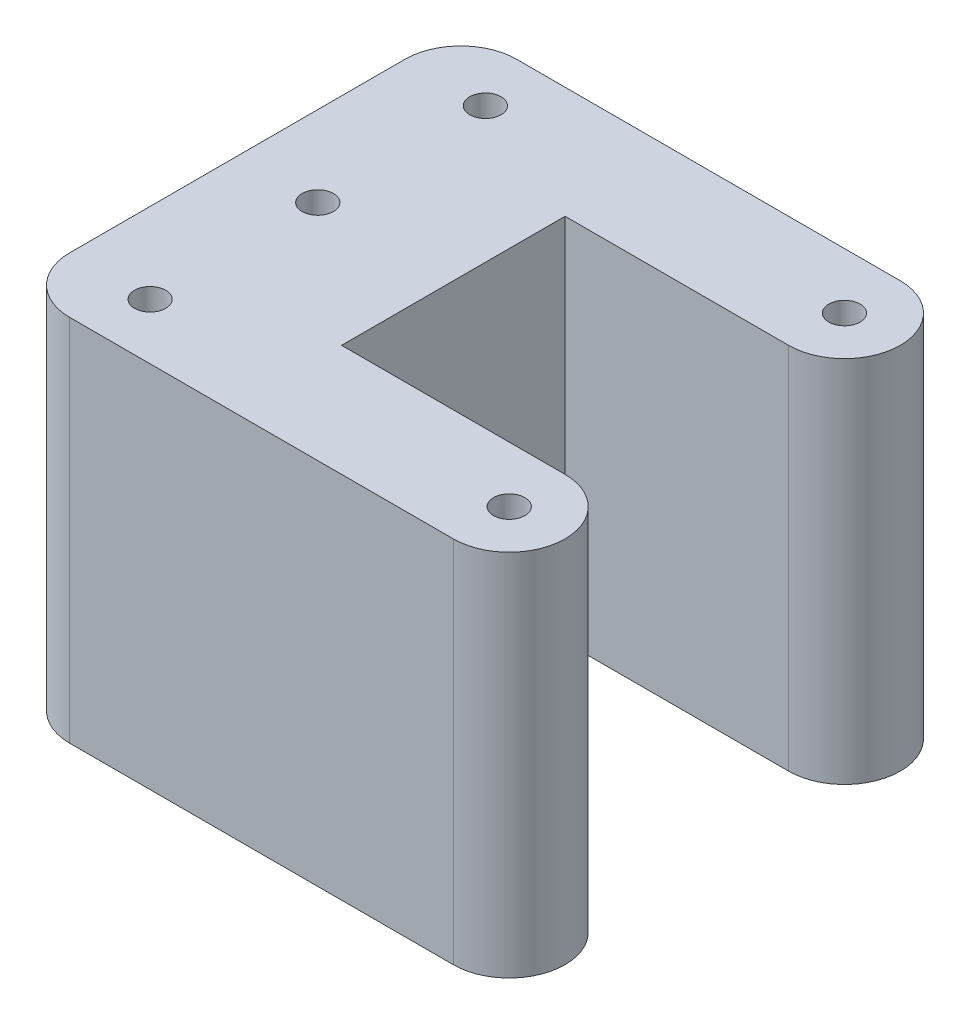
ISO-10303-21;
HEADER;
FILE_DESCRIPTION(('STEP AP214'),'2;1');
FILE_NAME('part.step','',(''),(''),'','','');
FILE_SCHEMA(('AUTOMOTIVE_DESIGN { 1 0 10303 214 1 1 1 1 }'));
ENDSEC;
DATA;
#1=APPLICATION_CONTEXT('core data for automotive mechanical design processes');
#2=APPLICATION_PROTOCOL_DEFINITION('international standard','automotive_design',2000,#1);
#3=PRODUCT_CONTEXT('',#1,'mechanical');
#4=PRODUCT('Part','Part','',(#3));
#5=PRODUCT_RELATED_PRODUCT_CATEGORY('part','',(#4));
#6=PRODUCT_DEFINITION_FORMATION('','',#4);
#7=PRODUCT_DEFINITION_CONTEXT('part definition',#1,'design');
#8=PRODUCT_DEFINITION('design','',#6,#7);
#9=PRODUCT_DEFINITION_SHAPE('','',#8);
#10=(LENGTH_UNIT() NAMED_UNIT(*) SI_UNIT(.MILLI.,.METRE.));
#11=(NAMED_UNIT(*) PLANE_ANGLE_UNIT() SI_UNIT($,.RADIAN.));
#12=(NAMED_UNIT(*) SI_UNIT($,.STERADIAN.) SOLID_ANGLE_UNIT());
#13=UNCERTAINTY_MEASURE_WITH_UNIT(LENGTH_MEASURE(1.E-05),#10,'distance_accuracy_value','');
#14=(GEOMETRIC_REPRESENTATION_CONTEXT(3) GLOBAL_UNCERTAINTY_ASSIGNED_CONTEXT((#13)) GLOBAL_UNIT_ASSIGNED_CONTEXT((#10,
#11,#12)) REPRESENTATION_CONTEXT('',''));
#15=CARTESIAN_POINT('',(0.,0.,0.));
#16=DIRECTION('',(0.,0.,1.));
#17=DIRECTION('',(1.,0.,0.));
#18=AXIS2_PLACEMENT_3D('',#15,#16,#17);
#19=CARTESIAN_POINT('',(83.5391982911814,33.,20.5415917264897));
#20=DIRECTION('',(0.,-1.,0.));
#21=DIRECTION('',(0.,0.,-1.));
#22=AXIS2_PLACEMENT_3D('',#19,#20,#21);
#23=PLANE('',#22);
#24=CARTESIAN_POINT('',(83.5391982911814,33.,20.5415917264897));
#25=DIRECTION('',(0.,1.,0.));
#26=DIRECTION('',(0.,0.,-1.));
#27=AXIS2_PLACEMENT_3D('',#24,#25,#26);
#28=CIRCLE('',#27,4.99999999999941);
#29=CARTESIAN_POINT('',(83.5391982911814,33.,25.541591726489));
#30=VERTEX_POINT('',#29);
#31=CARTESIAN_POINT('',(83.5391982911814,33.,15.5415917264902));
#32=VERTEX_POINT('',#31);
#33=EDGE_CURVE('E163',#30,#32,#28,.T.);
#34=ORIENTED_EDGE('',*,*,#33,.T.);
#35=DIRECTION('',(-1.,0.,0.));
#36=VECTOR('',#35,1.);
#37=CARTESIAN_POINT('',(49.2055026651107,33.,15.5415917264894));
#38=LINE('',#37,#36);
#39=CARTESIAN_POINT('',(49.2055026651107,33.,15.5415917264894));
#40=VERTEX_POINT('',#39);
#41=EDGE_CURVE('E101',#32,#40,#38,.T.);
#42=ORIENTED_EDGE('',*,*,#41,.T.);
#43=CARTESIAN_POINT('',(49.2055026651106,33.,20.5415917264894));
#44=DIRECTION('',(0.,1.,0.));
#45=DIRECTION('',(0.,0.,1.));
#46=AXIS2_PLACEMENT_3D('',#43,#44,#45);
#47=CIRCLE('',#46,5.);
#48=CARTESIAN_POINT('',(44.2055026651106,33.,20.5415917264895));
#49=VERTEX_POINT('',#48);
#50=EDGE_CURVE('E184',#40,#49,#47,.T.);
#51=ORIENTED_EDGE('',*,*,#50,.T.);
#52=DIRECTION('',(0.,0.,1.));
#53=VECTOR('',#52,1.);
#54=CARTESIAN_POINT('',(44.2055026651106,33.,20.5415917264895));
#55=LINE('',#54,#53);
#56=CARTESIAN_POINT('',(44.2055026651109,33.,50.5415917264893));
#57=VERTEX_POINT('',#56);
#58=EDGE_CURVE('E203',#49,#57,#55,.T.);
#59=ORIENTED_EDGE('',*,*,#58,.T.);
#60=CARTESIAN_POINT('',(49.2055026651109,33.,50.5415917264893));
#61=DIRECTION('',(0.,1.,0.));
#62=DIRECTION('',(0.,0.,-1.));
#63=AXIS2_PLACEMENT_3D('',#60,#61,#62);
#64=CIRCLE('',#63,5.);
#65=CARTESIAN_POINT('',(49.2055026651109,33.,55.5415917264893));
#66=VERTEX_POINT('',#65);
#67=EDGE_CURVE('E200',#57,#66,#64,.T.);
#68=ORIENTED_EDGE('',*,*,#67,.T.);
#69=DIRECTION('',(1.,0.,0.));
#70=VECTOR('',#69,1.);
#71=CARTESIAN_POINT('',(49.2055026651109,33.,55.5415917264893));
#72=LINE('',#71,#70);
#73=CARTESIAN_POINT('',(83.5391982911814,33.,55.5415917264893));
#74=VERTEX_POINT('',#73);
#75=EDGE_CURVE('E202',#66,#74,#72,.T.);
#76=ORIENTED_EDGE('',*,*,#75,.T.);
#77=CARTESIAN_POINT('',(83.539198291182,33.,50.5415917264899));
#78=DIRECTION('',(0.,1.,0.));
#79=DIRECTION('',(0.,0.,1.));
#80=AXIS2_PLACEMENT_3D('',#77,#78,#79);
#81=CIRCLE('',#80,4.99999999999941);
#82=CARTESIAN_POINT('',(83.5391982911826,33.,45.5415917264905));
#83=VERTEX_POINT('',#82);
#84=EDGE_CURVE('E126',#74,#83,#81,.T.);
#85=ORIENTED_EDGE('',*,*,#84,.T.);
#86=DIRECTION('',(-1.,0.,0.));
#87=VECTOR('',#86,1.);
#88=CARTESIAN_POINT('',(63.5391982911814,33.,45.5415917264904));
#89=LINE('',#88,#87);
#90=CARTESIAN_POINT('',(63.5391982911814,33.,45.5415917264904));
#91=VERTEX_POINT('',#90);
#92=EDGE_CURVE('E120',#83,#91,#89,.T.);
#93=ORIENTED_EDGE('',*,*,#92,.T.);
#94=DIRECTION('',(0.,0.,-1.));
#95=VECTOR('',#94,1.);
#96=CARTESIAN_POINT('',(63.5391982911814,33.,45.5415917264904));
#97=LINE('',#96,#95);
#98=CARTESIAN_POINT('',(63.5391982911814,33.,25.5415917264891));
#99=VERTEX_POINT('',#98);
#100=EDGE_CURVE('E124',#91,#99,#97,.T.);
#101=ORIENTED_EDGE('',*,*,#100,.T.);
#102=DIRECTION('',(1.,0.,0.));
#103=VECTOR('',#102,1.);
#104=CARTESIAN_POINT('',(63.5391982911814,33.,25.5415917264891));
#105=LINE('',#104,#103);
#106=EDGE_CURVE('E52',#99,#30,#105,.T.);
#107=ORIENTED_EDGE('',*,*,#106,.T.);
#108=EDGE_LOOP('',(#34,#42,#51,#59,#68,#76,#85,#93,#101,#107));
#109=FACE_BOUND('',#108,.T.);
#110=CARTESIAN_POINT('',(83.5391982911814,33.,20.5415917264897));
#111=DIRECTION('',(0.,1.,0.));
#112=DIRECTION('',(0.,0.,1.));
#113=AXIS2_PLACEMENT_3D('',#110,#111,#112);
#114=CIRCLE('',#113,1.39999999999959);
#115=CARTESIAN_POINT('',(83.5391982911814,33.,21.9415917264893));
#116=VERTEX_POINT('',#115);
#117=EDGE_CURVE('E148',#116,#116,#114,.T.);
#118=ORIENTED_EDGE('',*,*,#117,.F.);
#119=EDGE_LOOP('',(#118));
#120=FACE_BOUND('',#119,.T.);
#121=CARTESIAN_POINT('',(83.539198291182,33.,50.5415917264899));
#122=DIRECTION('',(0.,1.,0.));
#123=DIRECTION('',(0.,0.,-1.));
#124=AXIS2_PLACEMENT_3D('',#121,#122,#123);
#125=CIRCLE('',#124,1.4);
#126=CARTESIAN_POINT('',(83.539198291182,33.,49.1415917264899));
#127=VERTEX_POINT('',#126);
#128=EDGE_CURVE('E214',#127,#127,#125,.T.);
#129=ORIENTED_EDGE('',*,*,#128,.F.);
#130=EDGE_LOOP('',(#129));
#131=FACE_BOUND('',#130,.T.);
#132=CARTESIAN_POINT('',(51.4060784315664,33.,20.5415917264911));
#133=DIRECTION('',(0.,1.,0.));
#134=DIRECTION('',(0.,0.,1.));
#135=AXIS2_PLACEMENT_3D('',#132,#133,#134);
#136=CIRCLE('',#135,1.4);
#137=CARTESIAN_POINT('',(51.4060784315664,33.,21.9415917264911));
#138=VERTEX_POINT('',#137);
#139=EDGE_CURVE('E220',#138,#138,#136,.T.);
#140=ORIENTED_EDGE('',*,*,#139,.F.);
#141=EDGE_LOOP('',(#140));
#142=FACE_BOUND('',#141,.T.);
#143=CARTESIAN_POINT('',(51.4060784315664,33.,35.5415917264893));
#144=DIRECTION('',(0.,1.,0.));
#145=DIRECTION('',(0.,0.,1.));
#146=AXIS2_PLACEMENT_3D('',#143,#144,#145);
#147=CIRCLE('',#146,1.4);
#148=CARTESIAN_POINT('',(51.4060784315664,33.,36.9415917264893));
#149=VERTEX_POINT('',#148);
#150=EDGE_CURVE('E226',#149,#149,#147,.T.);
#151=ORIENTED_EDGE('',*,*,#150,.F.);
#152=EDGE_LOOP('',(#151));
#153=FACE_BOUND('',#152,.T.);
#154=CARTESIAN_POINT('',(51.4060784315664,33.,50.5415917264874));
#155=DIRECTION('',(0.,1.,0.));
#156=DIRECTION('',(0.,0.,-1.));
#157=AXIS2_PLACEMENT_3D('',#154,#155,#156);
#158=CIRCLE('',#157,1.39999999999999);
#159=CARTESIAN_POINT('',(51.4060784315664,33.,49.1415917264874));
#160=VERTEX_POINT('',#159);
#161=EDGE_CURVE('E232',#160,#160,#158,.T.);
#162=ORIENTED_EDGE('',*,*,#161,.F.);
#163=EDGE_LOOP('',(#162));
#164=FACE_BOUND('',#163,.T.);
#165=ADVANCED_FACE('F35',(#109,#120,#131,#142,#153,#164),#23,.F.);
#166=CARTESIAN_POINT('',(83.5391982911814,0.,20.5415917264897));
#167=DIRECTION('',(0.,-1.,0.));
#168=DIRECTION('',(0.,0.,-1.));
#169=AXIS2_PLACEMENT_3D('',#166,#167,#168);
#170=PLANE('',#169);
#171=CARTESIAN_POINT('',(51.4060784315664,0.,35.5415917264893));
#172=DIRECTION('',(0.,1.,0.));
#173=DIRECTION('',(0.,0.,1.));
#174=AXIS2_PLACEMENT_3D('',#171,#172,#173);
#175=CIRCLE('',#174,1.4);
#176=CARTESIAN_POINT('',(51.4060784315664,0.,36.9415917264893));
#177=VERTEX_POINT('',#176);
#178=EDGE_CURVE('E229',#177,#177,#175,.T.);
#179=ORIENTED_EDGE('',*,*,#178,.T.);
#180=EDGE_LOOP('',(#179));
#181=FACE_BOUND('',#180,.T.);
#182=CARTESIAN_POINT('',(83.539198291182,0.,50.5415917264899));
#183=DIRECTION('',(0.,1.,0.));
#184=DIRECTION('',(0.,0.,-1.));
#185=AXIS2_PLACEMENT_3D('',#182,#183,#184);
#186=CIRCLE('',#185,1.4);
#187=CARTESIAN_POINT('',(83.539198291182,0.,49.1415917264899));
#188=VERTEX_POINT('',#187);
#189=EDGE_CURVE('E217',#188,#188,#186,.T.);
#190=ORIENTED_EDGE('',*,*,#189,.T.);
#191=EDGE_LOOP('',(#190));
#192=FACE_BOUND('',#191,.T.);
#193=CARTESIAN_POINT('',(83.5391982911814,0.,20.5415917264897));
#194=DIRECTION('',(0.,1.,0.));
#195=DIRECTION('',(0.,0.,-1.));
#196=AXIS2_PLACEMENT_3D('',#193,#194,#195);
#197=CIRCLE('',#196,4.99999999999941);
#198=CARTESIAN_POINT('',(83.5391982911814,0.,25.541591726489));
#199=VERTEX_POINT('',#198);
#200=CARTESIAN_POINT('',(83.5391982911814,0.,15.5415917264902));
#201=VERTEX_POINT('',#200);
#202=EDGE_CURVE('E144',#199,#201,#197,.T.);
#203=ORIENTED_EDGE('',*,*,#202,.F.);
#204=DIRECTION('',(1.,0.,0.));
#205=VECTOR('',#204,1.);
#206=CARTESIAN_POINT('',(63.5391982911814,0.,25.5415917264891));
#207=LINE('',#206,#205);
#208=CARTESIAN_POINT('',(63.5391982911814,0.,25.5415917264891));
#209=VERTEX_POINT('',#208);
#210=EDGE_CURVE('E93',#209,#199,#207,.T.);
#211=ORIENTED_EDGE('',*,*,#210,.F.);
#212=DIRECTION('',(0.,0.,-1.));
#213=VECTOR('',#212,1.);
#214=CARTESIAN_POINT('',(63.5391982911814,0.,45.5415917264904));
#215=LINE('',#214,#213);
#216=CARTESIAN_POINT('',(63.5391982911814,0.,45.5415917264904));
#217=VERTEX_POINT('',#216);
#218=EDGE_CURVE('E87',#217,#209,#215,.T.);
#219=ORIENTED_EDGE('',*,*,#218,.F.);
#220=DIRECTION('',(-1.,0.,0.));
#221=VECTOR('',#220,1.);
#222=CARTESIAN_POINT('',(63.5391982911814,0.,45.5415917264904));
#223=LINE('',#222,#221);
#224=CARTESIAN_POINT('',(83.5391982911826,0.,45.5415917264905));
#225=VERTEX_POINT('',#224);
#226=EDGE_CURVE('E134',#225,#217,#223,.T.);
#227=ORIENTED_EDGE('',*,*,#226,.F.);
#228=CARTESIAN_POINT('',(83.539198291182,0.,50.5415917264899));
#229=DIRECTION('',(0.,1.,0.));
#230=DIRECTION('',(0.,0.,1.));
#231=AXIS2_PLACEMENT_3D('',#228,#229,#230);
#232=CIRCLE('',#231,4.99999999999941);
#233=CARTESIAN_POINT('',(83.5391982911814,0.,55.5415917264893));
#234=VERTEX_POINT('',#233);
#235=EDGE_CURVE('E158',#234,#225,#232,.T.);
#236=ORIENTED_EDGE('',*,*,#235,.F.);
#237=DIRECTION('',(1.,0.,0.));
#238=VECTOR('',#237,1.);
#239=CARTESIAN_POINT('',(49.2055026651109,0.,55.5415917264893));
#240=LINE('',#239,#238);
#241=CARTESIAN_POINT('',(49.2055026651109,0.,55.5415917264893));
#242=VERTEX_POINT('',#241);
#243=EDGE_CURVE('E156',#242,#234,#240,.T.);
#244=ORIENTED_EDGE('',*,*,#243,.F.);
#245=CARTESIAN_POINT('',(49.2055026651109,0.,50.5415917264893));
#246=DIRECTION('',(0.,1.,0.));
#247=DIRECTION('',(0.,0.,-1.));
#248=AXIS2_PLACEMENT_3D('',#245,#246,#247);
#249=CIRCLE('',#248,5.);
#250=CARTESIAN_POINT('',(44.2055026651109,0.,50.5415917264893));
#251=VERTEX_POINT('',#250);
#252=EDGE_CURVE('E154',#251,#242,#249,.T.);
#253=ORIENTED_EDGE('',*,*,#252,.F.);
#254=DIRECTION('',(0.,0.,1.));
#255=VECTOR('',#254,1.);
#256=CARTESIAN_POINT('',(44.2055026651106,0.,20.5415917264895));
#257=LINE('',#256,#255);
#258=CARTESIAN_POINT('',(44.2055026651106,0.,20.5415917264895));
#259=VERTEX_POINT('',#258);
#260=EDGE_CURVE('E152',#259,#251,#257,.T.);
#261=ORIENTED_EDGE('',*,*,#260,.F.);
#262=CARTESIAN_POINT('',(49.2055026651106,0.,20.5415917264894));
#263=DIRECTION('',(0.,1.,0.));
#264=DIRECTION('',(0.,0.,1.));
#265=AXIS2_PLACEMENT_3D('',#262,#263,#264);
#266=CIRCLE('',#265,5.);
#267=CARTESIAN_POINT('',(49.2055026651107,0.,15.5415917264894));
#268=VERTEX_POINT('',#267);
#269=EDGE_CURVE('E150',#268,#259,#266,.T.);
#270=ORIENTED_EDGE('',*,*,#269,.F.);
#271=DIRECTION('',(-1.,0.,0.));
#272=VECTOR('',#271,1.);
#273=CARTESIAN_POINT('',(49.2055026651107,0.,15.5415917264894));
#274=LINE('',#273,#272);
#275=EDGE_CURVE('E147',#201,#268,#274,.T.);
#276=ORIENTED_EDGE('',*,*,#275,.F.);
#277=EDGE_LOOP('',(#203,#211,#219,#227,#236,#244,#253,#261,#270,#276));
#278=FACE_BOUND('',#277,.T.);
#279=CARTESIAN_POINT('',(83.5391982911814,0.,20.5415917264897));
#280=DIRECTION('',(0.,1.,0.));
#281=DIRECTION('',(0.,0.,1.));
#282=AXIS2_PLACEMENT_3D('',#279,#280,#281);
#283=CIRCLE('',#282,1.39999999999959);
#284=CARTESIAN_POINT('',(83.5391982911814,0.,21.9415917264893));
#285=VERTEX_POINT('',#284);
#286=EDGE_CURVE('E211',#285,#285,#283,.T.);
#287=ORIENTED_EDGE('',*,*,#286,.T.);
#288=EDGE_LOOP('',(#287));
#289=FACE_BOUND('',#288,.T.);
#290=CARTESIAN_POINT('',(51.4060784315664,0.,20.5415917264911));
#291=DIRECTION('',(0.,1.,0.));
#292=DIRECTION('',(0.,0.,1.));
#293=AXIS2_PLACEMENT_3D('',#290,#291,#292);
#294=CIRCLE('',#293,1.4);
#295=CARTESIAN_POINT('',(51.4060784315664,0.,21.9415917264911));
#296=VERTEX_POINT('',#295);
#297=EDGE_CURVE('E223',#296,#296,#294,.T.);
#298=ORIENTED_EDGE('',*,*,#297,.T.);
#299=EDGE_LOOP('',(#298));
#300=FACE_BOUND('',#299,.T.);
#301=CARTESIAN_POINT('',(51.4060784315664,0.,50.5415917264874));
#302=DIRECTION('',(0.,1.,0.));
#303=DIRECTION('',(0.,0.,-1.));
#304=AXIS2_PLACEMENT_3D('',#301,#302,#303);
#305=CIRCLE('',#304,1.39999999999999);
#306=CARTESIAN_POINT('',(51.4060784315664,0.,49.1415917264874));
#307=VERTEX_POINT('',#306);
#308=EDGE_CURVE('E235',#307,#307,#305,.T.);
#309=ORIENTED_EDGE('',*,*,#308,.T.);
#310=EDGE_LOOP('',(#309));
#311=FACE_BOUND('',#310,.T.);
#312=ADVANCED_FACE('F188',(#181,#192,#278,#289,#300,#311),#170,.T.);
#313=CARTESIAN_POINT('',(83.5391982911814,33.,20.5415917264897));
#314=DIRECTION('',(0.,-1.,0.));
#315=DIRECTION('',(0.,0.,-1.));
#316=AXIS2_PLACEMENT_3D('',#313,#314,#315);
#317=CYLINDRICAL_SURFACE('',#316,4.99999999999941);
#318=ORIENTED_EDGE('',*,*,#202,.T.);
#319=DIRECTION('',(0.,-1.,0.));
#320=VECTOR('',#319,1.);
#321=CARTESIAN_POINT('',(83.5391982911814,33.,15.5415917264902));
#322=LINE('',#321,#320);
#323=EDGE_CURVE('E11',#32,#201,#322,.T.);
#324=ORIENTED_EDGE('',*,*,#323,.F.);
#325=ORIENTED_EDGE('',*,*,#33,.F.);
#326=DIRECTION('',(0.,-1.,0.));
#327=VECTOR('',#326,1.);
#328=CARTESIAN_POINT('',(83.5391982911814,33.,25.541591726489));
#329=LINE('',#328,#327);
#330=EDGE_CURVE('E140',#30,#199,#329,.T.);
#331=ORIENTED_EDGE('',*,*,#330,.T.);
#332=EDGE_LOOP('',(#318,#324,#325,#331));
#333=FACE_BOUND('',#332,.T.);
#334=ADVANCED_FACE('F37',(#333),#317,.T.);
#335=CARTESIAN_POINT('',(49.2055026651107,33.,15.5415917264894));
#336=DIRECTION('',(0.,0.,1.));
#337=DIRECTION('',(1.,0.,0.));
#338=AXIS2_PLACEMENT_3D('',#335,#336,#337);
#339=PLANE('',#338);
#340=ORIENTED_EDGE('',*,*,#275,.T.);
#341=DIRECTION('',(0.,-1.,0.));
#342=VECTOR('',#341,1.);
#343=CARTESIAN_POINT('',(49.2055026651107,33.,15.5415917264894));
#344=LINE('',#343,#342);
#345=EDGE_CURVE('E44',#40,#268,#344,.T.);
#346=ORIENTED_EDGE('',*,*,#345,.F.);
#347=ORIENTED_EDGE('',*,*,#41,.F.);
#348=ORIENTED_EDGE('',*,*,#323,.T.);
#349=EDGE_LOOP('',(#340,#346,#347,#348));
#350=FACE_BOUND('',#349,.T.);
#351=ADVANCED_FACE('F275',(#350),#339,.F.);
#352=CARTESIAN_POINT('',(49.2055026651106,33.,20.5415917264894));
#353=DIRECTION('',(0.,-1.,0.));
#354=DIRECTION('',(0.,0.,-1.));
#355=AXIS2_PLACEMENT_3D('',#352,#353,#354);
#356=CYLINDRICAL_SURFACE('',#355,5.);
#357=ORIENTED_EDGE('',*,*,#269,.T.);
#358=DIRECTION('',(0.,-1.,0.));
#359=VECTOR('',#358,1.);
#360=CARTESIAN_POINT('',(44.2055026651106,33.,20.5415917264895));
#361=LINE('',#360,#359);
#362=EDGE_CURVE('E176',#49,#259,#361,.T.);
#363=ORIENTED_EDGE('',*,*,#362,.F.);
#364=ORIENTED_EDGE('',*,*,#50,.F.);
#365=ORIENTED_EDGE('',*,*,#345,.T.);
#366=EDGE_LOOP('',(#357,#363,#364,#365));
#367=FACE_BOUND('',#366,.T.);
#368=ADVANCED_FACE('F182',(#367),#356,.T.);
#369=CARTESIAN_POINT('',(44.2055026651106,33.,20.5415917264895));
#370=DIRECTION('',(1.,0.,0.));
#371=DIRECTION('',(0.,0.,-1.));
#372=AXIS2_PLACEMENT_3D('',#369,#370,#371);
#373=PLANE('',#372);
#374=ORIENTED_EDGE('',*,*,#260,.T.);
#375=DIRECTION('',(0.,-1.,0.));
#376=VECTOR('',#375,1.);
#377=CARTESIAN_POINT('',(44.2055026651109,33.,50.5415917264893));
#378=LINE('',#377,#376);
#379=EDGE_CURVE('E173',#57,#251,#378,.T.);
#380=ORIENTED_EDGE('',*,*,#379,.F.);
#381=ORIENTED_EDGE('',*,*,#58,.F.);
#382=ORIENTED_EDGE('',*,*,#362,.T.);
#383=EDGE_LOOP('',(#374,#380,#381,#382));
#384=FACE_BOUND('',#383,.T.);
#385=ADVANCED_FACE('F194',(#384),#373,.F.);
#386=CARTESIAN_POINT('',(49.2055026651109,33.,50.5415917264893));
#387=DIRECTION('',(0.,-1.,0.));
#388=DIRECTION('',(0.,0.,-1.));
#389=AXIS2_PLACEMENT_3D('',#386,#387,#388);
#390=CYLINDRICAL_SURFACE('',#389,5.);
#391=ORIENTED_EDGE('',*,*,#252,.T.);
#392=DIRECTION('',(0.,-1.,0.));
#393=VECTOR('',#392,1.);
#394=CARTESIAN_POINT('',(49.2055026651109,33.,55.5415917264893));
#395=LINE('',#394,#393);
#396=EDGE_CURVE('E170',#66,#242,#395,.T.);
#397=ORIENTED_EDGE('',*,*,#396,.F.);
#398=ORIENTED_EDGE('',*,*,#67,.F.);
#399=ORIENTED_EDGE('',*,*,#379,.T.);
#400=EDGE_LOOP('',(#391,#397,#398,#399));
#401=FACE_BOUND('',#400,.T.);
#402=ADVANCED_FACE('F198',(#401),#390,.T.);
#403=CARTESIAN_POINT('',(49.2055026651109,33.,55.5415917264893));
#404=DIRECTION('',(0.,0.,-1.));
#405=DIRECTION('',(-1.,0.,0.));
#406=AXIS2_PLACEMENT_3D('',#403,#404,#405);
#407=PLANE('',#406);
#408=ORIENTED_EDGE('',*,*,#243,.T.);
#409=DIRECTION('',(0.,-1.,0.));
#410=VECTOR('',#409,1.);
#411=CARTESIAN_POINT('',(83.5391982911814,33.,55.5415917264893));
#412=LINE('',#411,#410);
#413=EDGE_CURVE('E167',#74,#234,#412,.T.);
#414=ORIENTED_EDGE('',*,*,#413,.F.);
#415=ORIENTED_EDGE('',*,*,#75,.F.);
#416=ORIENTED_EDGE('',*,*,#396,.T.);
#417=EDGE_LOOP('',(#408,#414,#415,#416));
#418=FACE_BOUND('',#417,.T.);
#419=ADVANCED_FACE('F265',(#418),#407,.F.);
#420=CARTESIAN_POINT('',(83.539198291182,33.,50.5415917264899));
#421=DIRECTION('',(0.,-1.,0.));
#422=DIRECTION('',(0.,0.,-1.));
#423=AXIS2_PLACEMENT_3D('',#420,#421,#422);
#424=CYLINDRICAL_SURFACE('',#423,4.99999999999941);
#425=ORIENTED_EDGE('',*,*,#235,.T.);
#426=DIRECTION('',(0.,-1.,0.));
#427=VECTOR('',#426,1.);
#428=CARTESIAN_POINT('',(83.5391982911826,33.,45.5415917264905));
#429=LINE('',#428,#427);
#430=EDGE_CURVE('E135',#83,#225,#429,.T.);
#431=ORIENTED_EDGE('',*,*,#430,.F.);
#432=ORIENTED_EDGE('',*,*,#84,.F.);
#433=ORIENTED_EDGE('',*,*,#413,.T.);
#434=EDGE_LOOP('',(#425,#431,#432,#433));
#435=FACE_BOUND('',#434,.T.);
#436=ADVANCED_FACE('F262',(#435),#424,.T.);
#437=CARTESIAN_POINT('',(63.5391982911814,33.,45.5415917264904));
#438=DIRECTION('',(0.,0.,1.));
#439=DIRECTION('',(1.,0.,0.));
#440=AXIS2_PLACEMENT_3D('',#437,#438,#439);
#441=PLANE('',#440);
#442=ORIENTED_EDGE('',*,*,#226,.T.);
#443=DIRECTION('',(0.,-1.,0.));
#444=VECTOR('',#443,1.);
#445=CARTESIAN_POINT('',(63.5391982911814,33.,45.5415917264904));
#446=LINE('',#445,#444);
#447=EDGE_CURVE('E131',#91,#217,#446,.T.);
#448=ORIENTED_EDGE('',*,*,#447,.F.);
#449=ORIENTED_EDGE('',*,*,#92,.F.);
#450=ORIENTED_EDGE('',*,*,#430,.T.);
#451=EDGE_LOOP('',(#442,#448,#449,#450));
#452=FACE_BOUND('',#451,.T.);
#453=ADVANCED_FACE('F132',(#452),#441,.F.);
#454=CARTESIAN_POINT('',(63.5391982911814,33.,45.5415917264904));
#455=DIRECTION('',(-1.,0.,0.));
#456=DIRECTION('',(0.,0.,1.));
#457=AXIS2_PLACEMENT_3D('',#454,#455,#456);
#458=PLANE('',#457);
#459=ORIENTED_EDGE('',*,*,#218,.T.);
#460=DIRECTION('',(0.,-1.,0.));
#461=VECTOR('',#460,1.);
#462=CARTESIAN_POINT('',(63.5391982911814,33.,25.5415917264891));
#463=LINE('',#462,#461);
#464=EDGE_CURVE('E136',#99,#209,#463,.T.);
#465=ORIENTED_EDGE('',*,*,#464,.F.);
#466=ORIENTED_EDGE('',*,*,#100,.F.);
#467=ORIENTED_EDGE('',*,*,#447,.T.);
#468=EDGE_LOOP('',(#459,#465,#466,#467));
#469=FACE_BOUND('',#468,.T.);
#470=ADVANCED_FACE('F138',(#469),#458,.F.);
#471=CARTESIAN_POINT('',(63.5391982911814,33.,25.5415917264891));
#472=DIRECTION('',(0.,0.,-1.));
#473=DIRECTION('',(-1.,0.,0.));
#474=AXIS2_PLACEMENT_3D('',#471,#472,#473);
#475=PLANE('',#474);
#476=ORIENTED_EDGE('',*,*,#210,.T.);
#477=ORIENTED_EDGE('',*,*,#330,.F.);
#478=ORIENTED_EDGE('',*,*,#106,.F.);
#479=ORIENTED_EDGE('',*,*,#464,.T.);
#480=EDGE_LOOP('',(#476,#477,#478,#479));
#481=FACE_BOUND('',#480,.T.);
#482=ADVANCED_FACE('F255',(#481),#475,.F.);
#483=CARTESIAN_POINT('',(83.5391982911814,33.,20.5415917264897));
#484=DIRECTION('',(0.,-1.,0.));
#485=DIRECTION('',(0.,0.,-1.));
#486=AXIS2_PLACEMENT_3D('',#483,#484,#485);
#487=CYLINDRICAL_SURFACE('',#486,1.39999999999959);
#488=ORIENTED_EDGE('',*,*,#117,.T.);
#489=EDGE_LOOP('',(#488));
#490=FACE_BOUND('',#489,.T.);
#491=ORIENTED_EDGE('',*,*,#286,.F.);
#492=EDGE_LOOP('',(#491));
#493=FACE_BOUND('',#492,.T.);
#494=ADVANCED_FACE('F252',(#490,#493),#487,.F.);
#495=CARTESIAN_POINT('',(83.539198291182,33.,50.5415917264899));
#496=DIRECTION('',(0.,-1.,0.));
#497=DIRECTION('',(0.,0.,-1.));
#498=AXIS2_PLACEMENT_3D('',#495,#496,#497);
#499=CYLINDRICAL_SURFACE('',#498,1.4);
#500=ORIENTED_EDGE('',*,*,#128,.T.);
#501=EDGE_LOOP('',(#500));
#502=FACE_BOUND('',#501,.T.);
#503=ORIENTED_EDGE('',*,*,#189,.F.);
#504=EDGE_LOOP('',(#503));
#505=FACE_BOUND('',#504,.T.);
#506=ADVANCED_FACE('F351',(#502,#505),#499,.F.);
#507=CARTESIAN_POINT('',(51.4060784315664,33.,20.5415917264911));
#508=DIRECTION('',(0.,-1.,0.));
#509=DIRECTION('',(0.,0.,-1.));
#510=AXIS2_PLACEMENT_3D('',#507,#508,#509);
#511=CYLINDRICAL_SURFACE('',#510,1.4);
#512=ORIENTED_EDGE('',*,*,#139,.T.);
#513=EDGE_LOOP('',(#512));
#514=FACE_BOUND('',#513,.T.);
#515=ORIENTED_EDGE('',*,*,#297,.F.);
#516=EDGE_LOOP('',(#515));
#517=FACE_BOUND('',#516,.T.);
#518=ADVANCED_FACE('F359',(#514,#517),#511,.F.);
#519=CARTESIAN_POINT('',(51.4060784315664,33.,35.5415917264893));
#520=DIRECTION('',(0.,-1.,0.));
#521=DIRECTION('',(0.,0.,-1.));
#522=AXIS2_PLACEMENT_3D('',#519,#520,#521);
#523=CYLINDRICAL_SURFACE('',#522,1.4);
#524=ORIENTED_EDGE('',*,*,#150,.T.);
#525=EDGE_LOOP('',(#524));
#526=FACE_BOUND('',#525,.T.);
#527=ORIENTED_EDGE('',*,*,#178,.F.);
#528=EDGE_LOOP('',(#527));
#529=FACE_BOUND('',#528,.T.);
#530=ADVANCED_FACE('F367',(#526,#529),#523,.F.);
#531=CARTESIAN_POINT('',(51.4060784315664,33.,50.5415917264874));
#532=DIRECTION('',(0.,-1.,0.));
#533=DIRECTION('',(0.,0.,-1.));
#534=AXIS2_PLACEMENT_3D('',#531,#532,#533);
#535=CYLINDRICAL_SURFACE('',#534,1.39999999999999);
#536=ORIENTED_EDGE('',*,*,#161,.T.);
#537=EDGE_LOOP('',(#536));
#538=FACE_BOUND('',#537,.T.);
#539=ORIENTED_EDGE('',*,*,#308,.F.);
#540=EDGE_LOOP('',(#539));
#541=FACE_BOUND('',#540,.T.);
#542=ADVANCED_FACE('F241',(#538,#541),#535,.F.);
#543=CLOSED_SHELL('',(#165,#312,#334,#351,#368,#385,#402,#419,#436,#453,#470,#482,#494,#506,
#518,#530,#542));
#544=MANIFOLD_SOLID_BREP('B2',#543);
#545=ADVANCED_BREP_SHAPE_REPRESENTATION('',(#18,#544),#14);
#546=SHAPE_DEFINITION_REPRESENTATION(#9,#545);
ENDSEC;
END-ISO-10303-21;
